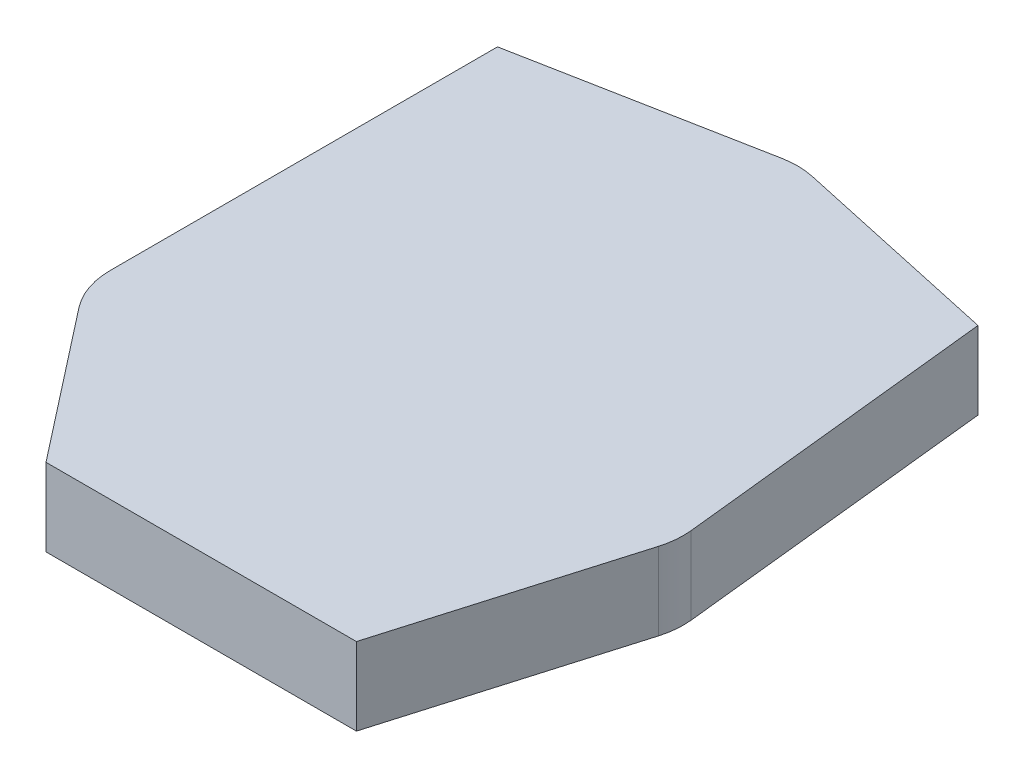
ISO-10303-21;
HEADER;
FILE_DESCRIPTION(('STEP AP214'),'2;1');
FILE_NAME('part.step','',(''),(''),'','','');
FILE_SCHEMA(('AUTOMOTIVE_DESIGN { 1 0 10303 214 1 1 1 1 }'));
ENDSEC;
DATA;
#1=APPLICATION_CONTEXT('core data for automotive mechanical design processes');
#2=APPLICATION_PROTOCOL_DEFINITION('international standard','automotive_design',2000,#1);
#3=PRODUCT_CONTEXT('',#1,'mechanical');
#4=PRODUCT('Part','Part','',(#3));
#5=PRODUCT_RELATED_PRODUCT_CATEGORY('part','',(#4));
#6=PRODUCT_DEFINITION_FORMATION('','',#4);
#7=PRODUCT_DEFINITION_CONTEXT('part definition',#1,'design');
#8=PRODUCT_DEFINITION('design','',#6,#7);
#9=PRODUCT_DEFINITION_SHAPE('','',#8);
#10=(LENGTH_UNIT() NAMED_UNIT(*) SI_UNIT(.MILLI.,.METRE.));
#11=(NAMED_UNIT(*) PLANE_ANGLE_UNIT() SI_UNIT($,.RADIAN.));
#12=(NAMED_UNIT(*) SI_UNIT($,.STERADIAN.) SOLID_ANGLE_UNIT());
#13=UNCERTAINTY_MEASURE_WITH_UNIT(LENGTH_MEASURE(1.E-05),#10,'distance_accuracy_value','');
#14=(GEOMETRIC_REPRESENTATION_CONTEXT(3) GLOBAL_UNCERTAINTY_ASSIGNED_CONTEXT((#13)) GLOBAL_UNIT_ASSIGNED_CONTEXT((#10,
#11,#12)) REPRESENTATION_CONTEXT('',''));
#15=CARTESIAN_POINT('',(0.,0.,0.));
#16=DIRECTION('',(0.,0.,1.));
#17=DIRECTION('',(1.,0.,0.));
#18=AXIS2_PLACEMENT_3D('',#15,#16,#17);
#19=CARTESIAN_POINT('',(60.,15.,0.));
#20=DIRECTION('',(0.,0.,-1.));
#21=DIRECTION('',(-1.,0.,0.));
#22=AXIS2_PLACEMENT_3D('',#19,#20,#21);
#23=PLANE('',#22);
#24=DIRECTION('',(1.,0.,0.));
#25=VECTOR('',#24,1.);
#26=CARTESIAN_POINT('',(60.,0.,0.));
#27=LINE('',#26,#25);
#28=CARTESIAN_POINT('',(0.,0.,0.));
#29=VERTEX_POINT('',#28);
#30=CARTESIAN_POINT('',(60.,0.,0.));
#31=VERTEX_POINT('',#30);
#32=EDGE_CURVE('E141',#29,#31,#27,.T.);
#33=ORIENTED_EDGE('',*,*,#32,.T.);
#34=DIRECTION('',(0.,-1.,0.));
#35=VECTOR('',#34,1.);
#36=CARTESIAN_POINT('',(60.,15.,0.));
#37=LINE('',#36,#35);
#38=CARTESIAN_POINT('',(60.,15.,0.));
#39=VERTEX_POINT('',#38);
#40=EDGE_CURVE('E120',#39,#31,#37,.T.);
#41=ORIENTED_EDGE('',*,*,#40,.F.);
#42=DIRECTION('',(1.,0.,0.));
#43=VECTOR('',#42,1.);
#44=CARTESIAN_POINT('',(60.,15.,0.));
#45=LINE('',#44,#43);
#46=CARTESIAN_POINT('',(0.,15.,0.));
#47=VERTEX_POINT('',#46);
#48=EDGE_CURVE('E128',#47,#39,#45,.T.);
#49=ORIENTED_EDGE('',*,*,#48,.F.);
#50=DIRECTION('',(0.,-1.,0.));
#51=VECTOR('',#50,1.);
#52=CARTESIAN_POINT('',(0.,15.,0.));
#53=LINE('',#52,#51);
#54=EDGE_CURVE('E193',#47,#29,#53,.T.);
#55=ORIENTED_EDGE('',*,*,#54,.T.);
#56=EDGE_LOOP('',(#33,#41,#49,#55));
#57=FACE_BOUND('',#56,.T.);
#58=ADVANCED_FACE('F37',(#57),#23,.F.);
#59=CARTESIAN_POINT('',(74.0901522682419,15.,-47.9736136752044));
#60=DIRECTION('',(-0.959472273504088,0.,-0.281803045364837));
#61=DIRECTION('',(-0.281803045364837,0.,0.959472273504088));
#62=AXIS2_PLACEMENT_3D('',#59,#60,#61);
#63=PLANE('',#62);
#64=DIRECTION('',(0.281803045364837,0.,-0.959472273504088));
#65=VECTOR('',#64,1.);
#66=CARTESIAN_POINT('',(74.0901522682419,0.,-47.9736136752044));
#67=LINE('',#66,#65);
#68=CARTESIAN_POINT('',(73.251356171326,0.,-45.1177126785622));
#69=VERTEX_POINT('',#68);
#70=EDGE_CURVE('E252',#31,#69,#67,.T.);
#71=ORIENTED_EDGE('',*,*,#70,.T.);
#72=DIRECTION('',(0.,-1.,0.));
#73=VECTOR('',#72,1.);
#74=CARTESIAN_POINT('',(73.251356171326,15.,-45.1177126785622));
#75=LINE('',#74,#73);
#76=CARTESIAN_POINT('',(73.251356171326,15.,-45.1177126785622));
#77=VERTEX_POINT('',#76);
#78=EDGE_CURVE('E123',#69,#77,#75,.F.);
#79=ORIENTED_EDGE('',*,*,#78,.T.);
#80=DIRECTION('',(0.281803045364837,0.,-0.959472273504088));
#81=VECTOR('',#80,1.);
#82=CARTESIAN_POINT('',(74.0901522682419,15.,-47.9736136752044));
#83=LINE('',#82,#81);
#84=EDGE_CURVE('E115',#39,#77,#83,.T.);
#85=ORIENTED_EDGE('',*,*,#84,.F.);
#86=ORIENTED_EDGE('',*,*,#40,.T.);
#87=EDGE_LOOP('',(#71,#79,#85,#86));
#88=FACE_BOUND('',#87,.T.);
#89=ADVANCED_FACE('F118',(#88),#63,.F.);
#90=CARTESIAN_POINT('',(67.167075345165,15.,-112.973613675204));
#91=DIRECTION('',(-0.994375736539281,0.,0.10590984176158));
#92=DIRECTION('',(0.10590984176158,0.,0.994375736539281));
#93=AXIS2_PLACEMENT_3D('',#90,#91,#92);
#94=PLANE('',#93);
#95=DIRECTION('',(-0.10590984176158,0.,-0.994375736539281));
#96=VECTOR('',#95,1.);
#97=CARTESIAN_POINT('',(67.167075345165,15.,-112.973613675204));
#98=LINE('',#97,#96);
#99=CARTESIAN_POINT('',(73.7749081168539,15.,-50.9334059854584));
#100=VERTEX_POINT('',#99);
#101=CARTESIAN_POINT('',(67.167075345165,15.,-112.973613675204));
#102=VERTEX_POINT('',#101);
#103=EDGE_CURVE('E127',#100,#102,#98,.T.);
#104=ORIENTED_EDGE('',*,*,#103,.F.);
#105=DIRECTION('',(0.,-1.,0.));
#106=VECTOR('',#105,1.);
#107=CARTESIAN_POINT('',(73.7749081168539,15.,-50.9334059854584));
#108=LINE('',#107,#106);
#109=CARTESIAN_POINT('',(73.7749081168539,0.,-50.9334059854584));
#110=VERTEX_POINT('',#109);
#111=EDGE_CURVE('E159',#100,#110,#108,.T.);
#112=ORIENTED_EDGE('',*,*,#111,.T.);
#113=DIRECTION('',(-0.10590984176158,0.,-0.994375736539281));
#114=VECTOR('',#113,1.);
#115=CARTESIAN_POINT('',(67.167075345165,0.,-112.973613675204));
#116=LINE('',#115,#114);
#117=CARTESIAN_POINT('',(67.167075345165,0.,-112.973613675204));
#118=VERTEX_POINT('',#117);
#119=EDGE_CURVE('E188',#110,#118,#116,.T.);
#120=ORIENTED_EDGE('',*,*,#119,.T.);
#121=DIRECTION('',(0.,-1.,0.));
#122=VECTOR('',#121,1.);
#123=CARTESIAN_POINT('',(67.167075345165,15.,-112.973613675204));
#124=LINE('',#123,#122);
#125=EDGE_CURVE('E143',#102,#118,#124,.T.);
#126=ORIENTED_EDGE('',*,*,#125,.F.);
#127=EDGE_LOOP('',(#104,#112,#120,#126));
#128=FACE_BOUND('',#127,.T.);
#129=ADVANCED_FACE('F238',(#128),#94,.F.);
#130=CARTESIAN_POINT('',(23.2007480239533,15.,-122.563298856902));
#131=DIRECTION('',(-0.213104115148841,0.,0.977029496026926));
#132=DIRECTION('',(0.977029496026926,0.,0.213104115148841));
#133=AXIS2_PLACEMENT_3D('',#130,#131,#132);
#134=PLANE('',#133);
#135=DIRECTION('',(-0.977029496026926,0.,-0.213104115148841));
#136=VECTOR('',#135,1.);
#137=CARTESIAN_POINT('',(23.2007480239533,0.,-122.563298856902));
#138=LINE('',#137,#136);
#139=CARTESIAN_POINT('',(26.199394640737,0.,-121.909251116775));
#140=VERTEX_POINT('',#139);
#141=EDGE_CURVE('E185',#118,#140,#138,.T.);
#142=ORIENTED_EDGE('',*,*,#141,.T.);
#143=DIRECTION('',(0.,-1.,0.));
#144=VECTOR('',#143,1.);
#145=CARTESIAN_POINT('',(26.199394640737,15.,-121.909251116775));
#146=LINE('',#145,#144);
#147=CARTESIAN_POINT('',(26.199394640737,15.,-121.909251116775));
#148=VERTEX_POINT('',#147);
#149=EDGE_CURVE('E46',#140,#148,#146,.F.);
#150=ORIENTED_EDGE('',*,*,#149,.T.);
#151=DIRECTION('',(-0.977029496026926,0.,-0.213104115148841));
#152=VECTOR('',#151,1.);
#153=CARTESIAN_POINT('',(23.2007480239533,15.,-122.563298856902));
#154=LINE('',#153,#152);
#155=EDGE_CURVE('E206',#102,#148,#154,.T.);
#156=ORIENTED_EDGE('',*,*,#155,.F.);
#157=ORIENTED_EDGE('',*,*,#125,.T.);
#158=EDGE_LOOP('',(#142,#150,#156,#157));
#159=FACE_BOUND('',#158,.T.);
#160=ADVANCED_FACE('F257',(#159),#134,.F.);
#161=CARTESIAN_POINT('',(-25.9098477317582,15.,-113.17450849184));
#162=DIRECTION('',(0.18777580730125,0.,0.98221191511423));
#163=DIRECTION('',(0.98221191511423,0.,-0.18777580730125));
#164=AXIS2_PLACEMENT_3D('',#161,#162,#163);
#165=PLANE('',#164);
#166=DIRECTION('',(-0.98221191511423,0.,0.18777580730125));
#167=VECTOR('',#166,1.);
#168=CARTESIAN_POINT('',(-25.9098477317582,15.,-113.17450849184));
#169=LINE('',#168,#167);
#170=CARTESIAN_POINT('',(20.1861958039856,15.,-121.986987403085));
#171=VERTEX_POINT('',#170);
#172=CARTESIAN_POINT('',(-25.9098477317582,15.,-113.17450849184));
#173=VERTEX_POINT('',#172);
#174=EDGE_CURVE('E178',#171,#173,#169,.T.);
#175=ORIENTED_EDGE('',*,*,#174,.F.);
#176=DIRECTION('',(0.,-1.,0.));
#177=VECTOR('',#176,1.);
#178=CARTESIAN_POINT('',(20.1861958039856,15.,-121.986987403085));
#179=LINE('',#178,#177);
#180=CARTESIAN_POINT('',(20.1861958039856,0.,-121.986987403085));
#181=VERTEX_POINT('',#180);
#182=EDGE_CURVE('E168',#171,#181,#179,.T.);
#183=ORIENTED_EDGE('',*,*,#182,.T.);
#184=DIRECTION('',(-0.98221191511423,0.,0.18777580730125));
#185=VECTOR('',#184,1.);
#186=CARTESIAN_POINT('',(-25.9098477317582,0.,-113.17450849184));
#187=LINE('',#186,#185);
#188=CARTESIAN_POINT('',(-25.9098477317582,0.,-113.17450849184));
#189=VERTEX_POINT('',#188);
#190=EDGE_CURVE('E176',#181,#189,#187,.T.);
#191=ORIENTED_EDGE('',*,*,#190,.T.);
#192=DIRECTION('',(0.,-1.,0.));
#193=VECTOR('',#192,1.);
#194=CARTESIAN_POINT('',(-25.9098477317582,15.,-113.17450849184));
#195=LINE('',#194,#193);
#196=EDGE_CURVE('E149',#173,#189,#195,.T.);
#197=ORIENTED_EDGE('',*,*,#196,.F.);
#198=EDGE_LOOP('',(#175,#183,#191,#197));
#199=FACE_BOUND('',#198,.T.);
#200=ADVANCED_FACE('F174',(#199),#165,.F.);
#201=CARTESIAN_POINT('',(-25.9098477317582,15.,-33.1745084918398));
#202=DIRECTION('',(1.,0.,0.));
#203=DIRECTION('',(0.,0.,-1.));
#204=AXIS2_PLACEMENT_3D('',#201,#202,#203);
#205=PLANE('',#204);
#206=DIRECTION('',(0.,0.,1.));
#207=VECTOR('',#206,1.);
#208=CARTESIAN_POINT('',(-25.9098477317582,0.,-33.1745084918398));
#209=LINE('',#208,#207);
#210=CARTESIAN_POINT('',(-25.9098477317582,0.,-38.338022016361));
#211=VERTEX_POINT('',#210);
#212=EDGE_CURVE('E184',#189,#211,#209,.T.);
#213=ORIENTED_EDGE('',*,*,#212,.T.);
#214=DIRECTION('',(0.,-1.,0.));
#215=VECTOR('',#214,1.);
#216=CARTESIAN_POINT('',(-25.9098477317582,15.,-38.338022016361));
#217=LINE('',#216,#215);
#218=CARTESIAN_POINT('',(-25.9098477317582,15.,-38.338022016361));
#219=VERTEX_POINT('',#218);
#220=EDGE_CURVE('E154',#211,#219,#217,.F.);
#221=ORIENTED_EDGE('',*,*,#220,.T.);
#222=DIRECTION('',(0.,0.,1.));
#223=VECTOR('',#222,1.);
#224=CARTESIAN_POINT('',(-25.9098477317582,15.,-33.1745084918398));
#225=LINE('',#224,#223);
#226=EDGE_CURVE('E199',#173,#219,#225,.T.);
#227=ORIENTED_EDGE('',*,*,#226,.F.);
#228=ORIENTED_EDGE('',*,*,#196,.T.);
#229=EDGE_LOOP('',(#213,#221,#227,#228));
#230=FACE_BOUND('',#229,.T.);
#231=ADVANCED_FACE('F196',(#230),#205,.F.);
#232=CARTESIAN_POINT('',(0.,15.,0.));
#233=DIRECTION('',(0.788113537305242,0.,-0.615529895550345));
#234=DIRECTION('',(-0.615529895550345,0.,-0.788113537305242));
#235=AXIS2_PLACEMENT_3D('',#232,#233,#234);
#236=PLANE('',#235);
#237=DIRECTION('',(0.615529895550345,0.,0.788113537305242));
#238=VECTOR('',#237,1.);
#239=CARTESIAN_POINT('',(0.,15.,0.));
#240=LINE('',#239,#238);
#241=CARTESIAN_POINT('',(-22.7315507913369,15.,-29.1050735831059));
#242=VERTEX_POINT('',#241);
#243=EDGE_CURVE('E133',#242,#47,#240,.T.);
#244=ORIENTED_EDGE('',*,*,#243,.F.);
#245=DIRECTION('',(0.,-1.,0.));
#246=VECTOR('',#245,1.);
#247=CARTESIAN_POINT('',(-22.7315507913368,15.,-29.1050735831059));
#248=LINE('',#247,#246);
#249=CARTESIAN_POINT('',(-22.7315507913369,0.,-29.1050735831059));
#250=VERTEX_POINT('',#249);
#251=EDGE_CURVE('E142',#242,#250,#248,.T.);
#252=ORIENTED_EDGE('',*,*,#251,.T.);
#253=DIRECTION('',(0.615529895550345,0.,0.788113537305242));
#254=VECTOR('',#253,1.);
#255=CARTESIAN_POINT('',(0.,0.,0.));
#256=LINE('',#255,#254);
#257=EDGE_CURVE('E138',#250,#29,#256,.T.);
#258=ORIENTED_EDGE('',*,*,#257,.T.);
#259=ORIENTED_EDGE('',*,*,#54,.F.);
#260=EDGE_LOOP('',(#244,#252,#258,#259));
#261=FACE_BOUND('',#260,.T.);
#262=ADVANCED_FACE('F250',(#261),#236,.F.);
#263=CARTESIAN_POINT('',(0.,15.,0.));
#264=DIRECTION('',(0.,-1.,0.));
#265=DIRECTION('',(0.,0.,-1.));
#266=AXIS2_PLACEMENT_3D('',#263,#264,#265);
#267=PLANE('',#266);
#268=ORIENTED_EDGE('',*,*,#155,.T.);
#269=CARTESIAN_POINT('',(23.0028329135043,15.,-107.253808676371));
#270=DIRECTION('',(0.,-1.,0.));
#271=DIRECTION('',(0.,0.,-1.));
#272=AXIS2_PLACEMENT_3D('',#269,#270,#271);
#273=CIRCLE('',#272,15.);
#274=EDGE_CURVE('E12',#148,#171,#273,.F.);
#275=ORIENTED_EDGE('',*,*,#274,.T.);
#276=ORIENTED_EDGE('',*,*,#174,.T.);
#277=ORIENTED_EDGE('',*,*,#226,.T.);
#278=CARTESIAN_POINT('',(-10.9098477317582,15.,-38.338022016361));
#279=DIRECTION('',(0.,-1.,0.));
#280=DIRECTION('',(0.,0.,-1.));
#281=AXIS2_PLACEMENT_3D('',#278,#279,#280);
#282=CIRCLE('',#281,15.);
#283=EDGE_CURVE('E156',#219,#242,#282,.F.);
#284=ORIENTED_EDGE('',*,*,#283,.T.);
#285=ORIENTED_EDGE('',*,*,#243,.T.);
#286=ORIENTED_EDGE('',*,*,#48,.T.);
#287=ORIENTED_EDGE('',*,*,#84,.T.);
#288=CARTESIAN_POINT('',(58.8592720687647,15.,-49.3447583590347));
#289=DIRECTION('',(0.,-1.,0.));
#290=DIRECTION('',(0.,0.,-1.));
#291=AXIS2_PLACEMENT_3D('',#288,#289,#290);
#292=CIRCLE('',#291,15.);
#293=EDGE_CURVE('E165',#77,#100,#292,.F.);
#294=ORIENTED_EDGE('',*,*,#293,.T.);
#295=ORIENTED_EDGE('',*,*,#103,.T.);
#296=EDGE_LOOP('',(#268,#275,#276,#277,#284,#285,#286,#287,#294,#295));
#297=FACE_BOUND('',#296,.T.);
#298=ADVANCED_FACE('F131',(#297),#267,.F.);
#299=CARTESIAN_POINT('',(0.,0.,0.));
#300=DIRECTION('',(0.,-1.,0.));
#301=DIRECTION('',(0.,0.,-1.));
#302=AXIS2_PLACEMENT_3D('',#299,#300,#301);
#303=PLANE('',#302);
#304=ORIENTED_EDGE('',*,*,#190,.F.);
#305=CARTESIAN_POINT('',(23.0028329135043,0.,-107.253808676371));
#306=DIRECTION('',(0.,-1.,0.));
#307=DIRECTION('',(0.,0.,-1.));
#308=AXIS2_PLACEMENT_3D('',#305,#306,#307);
#309=CIRCLE('',#308,15.);
#310=EDGE_CURVE('E60',#181,#140,#309,.T.);
#311=ORIENTED_EDGE('',*,*,#310,.T.);
#312=ORIENTED_EDGE('',*,*,#141,.F.);
#313=ORIENTED_EDGE('',*,*,#119,.F.);
#314=CARTESIAN_POINT('',(58.8592720687647,0.,-49.3447583590347));
#315=DIRECTION('',(0.,-1.,0.));
#316=DIRECTION('',(0.,0.,-1.));
#317=AXIS2_PLACEMENT_3D('',#314,#315,#316);
#318=CIRCLE('',#317,15.);
#319=EDGE_CURVE('E162',#110,#69,#318,.T.);
#320=ORIENTED_EDGE('',*,*,#319,.T.);
#321=ORIENTED_EDGE('',*,*,#70,.F.);
#322=ORIENTED_EDGE('',*,*,#32,.F.);
#323=ORIENTED_EDGE('',*,*,#257,.F.);
#324=CARTESIAN_POINT('',(-10.9098477317582,0.,-38.338022016361));
#325=DIRECTION('',(0.,-1.,0.));
#326=DIRECTION('',(0.,0.,-1.));
#327=AXIS2_PLACEMENT_3D('',#324,#325,#326);
#328=CIRCLE('',#327,15.);
#329=EDGE_CURVE('E146',#250,#211,#328,.T.);
#330=ORIENTED_EDGE('',*,*,#329,.T.);
#331=ORIENTED_EDGE('',*,*,#212,.F.);
#332=EDGE_LOOP('',(#304,#311,#312,#313,#320,#321,#322,#323,#330,#331));
#333=FACE_BOUND('',#332,.T.);
#334=ADVANCED_FACE('F182',(#333),#303,.T.);
#335=CARTESIAN_POINT('',(-10.9098477317582,15.,-38.338022016361));
#336=DIRECTION('',(0.,-1.,0.));
#337=DIRECTION('',(0.,0.,-1.));
#338=AXIS2_PLACEMENT_3D('',#335,#336,#337);
#339=CYLINDRICAL_SURFACE('',#338,15.);
#340=ORIENTED_EDGE('',*,*,#283,.F.);
#341=ORIENTED_EDGE('',*,*,#220,.F.);
#342=ORIENTED_EDGE('',*,*,#329,.F.);
#343=ORIENTED_EDGE('',*,*,#251,.F.);
#344=EDGE_LOOP('',(#340,#341,#342,#343));
#345=FACE_BOUND('',#344,.T.);
#346=ADVANCED_FACE('F231',(#345),#339,.T.);
#347=CARTESIAN_POINT('',(58.8592720687647,15.,-49.3447583590347));
#348=DIRECTION('',(0.,-1.,0.));
#349=DIRECTION('',(0.,0.,-1.));
#350=AXIS2_PLACEMENT_3D('',#347,#348,#349);
#351=CYLINDRICAL_SURFACE('',#350,15.);
#352=ORIENTED_EDGE('',*,*,#293,.F.);
#353=ORIENTED_EDGE('',*,*,#78,.F.);
#354=ORIENTED_EDGE('',*,*,#319,.F.);
#355=ORIENTED_EDGE('',*,*,#111,.F.);
#356=EDGE_LOOP('',(#352,#353,#354,#355));
#357=FACE_BOUND('',#356,.T.);
#358=ADVANCED_FACE('F227',(#357),#351,.T.);
#359=CARTESIAN_POINT('',(23.0028329135043,15.,-107.253808676371));
#360=DIRECTION('',(0.,-1.,0.));
#361=DIRECTION('',(0.,0.,-1.));
#362=AXIS2_PLACEMENT_3D('',#359,#360,#361);
#363=CYLINDRICAL_SURFACE('',#362,15.);
#364=ORIENTED_EDGE('',*,*,#274,.F.);
#365=ORIENTED_EDGE('',*,*,#149,.F.);
#366=ORIENTED_EDGE('',*,*,#310,.F.);
#367=ORIENTED_EDGE('',*,*,#182,.F.);
#368=EDGE_LOOP('',(#364,#365,#366,#367));
#369=FACE_BOUND('',#368,.T.);
#370=ADVANCED_FACE('F39',(#369),#363,.T.);
#371=CLOSED_SHELL('',(#58,#89,#129,#160,#200,#231,#262,#298,#334,#346,#358,#370));
#372=MANIFOLD_SOLID_BREP('B2',#371);
#373=ADVANCED_BREP_SHAPE_REPRESENTATION('',(#18,#372),#14);
#374=SHAPE_DEFINITION_REPRESENTATION(#9,#373);
ENDSEC;
END-ISO-10303-21;
